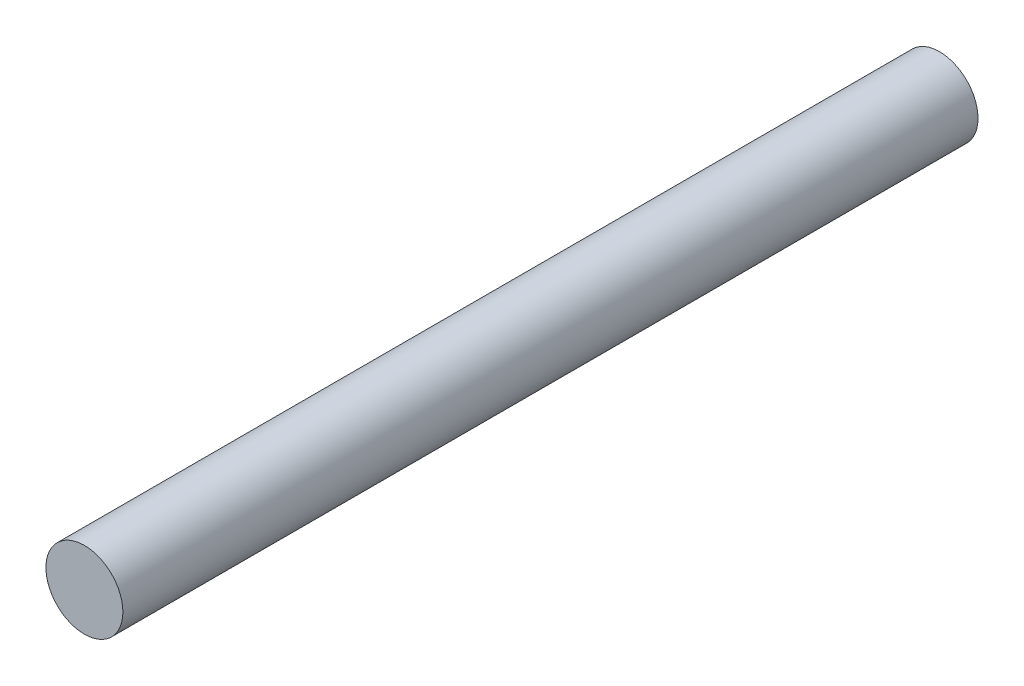
ISO-10303-21;
HEADER;
FILE_DESCRIPTION(('STEP AP214'),'2;1');
FILE_NAME('part.step','',(''),(''),'','','');
FILE_SCHEMA(('AUTOMOTIVE_DESIGN { 1 0 10303 214 1 1 1 1 }'));
ENDSEC;
DATA;
#1=APPLICATION_CONTEXT('core data for automotive mechanical design processes');
#2=APPLICATION_PROTOCOL_DEFINITION('international standard','automotive_design',2000,#1);
#3=PRODUCT_CONTEXT('',#1,'mechanical');
#4=PRODUCT('Part','Part','',(#3));
#5=PRODUCT_RELATED_PRODUCT_CATEGORY('part','',(#4));
#6=PRODUCT_DEFINITION_FORMATION('','',#4);
#7=PRODUCT_DEFINITION_CONTEXT('part definition',#1,'design');
#8=PRODUCT_DEFINITION('design','',#6,#7);
#9=PRODUCT_DEFINITION_SHAPE('','',#8);
#10=(LENGTH_UNIT() NAMED_UNIT(*) SI_UNIT(.MILLI.,.METRE.));
#11=(NAMED_UNIT(*) PLANE_ANGLE_UNIT() SI_UNIT($,.RADIAN.));
#12=(NAMED_UNIT(*) SI_UNIT($,.STERADIAN.) SOLID_ANGLE_UNIT());
#13=UNCERTAINTY_MEASURE_WITH_UNIT(LENGTH_MEASURE(1.E-05),#10,'distance_accuracy_value','');
#14=(GEOMETRIC_REPRESENTATION_CONTEXT(3) GLOBAL_UNCERTAINTY_ASSIGNED_CONTEXT((#13)) GLOBAL_UNIT_ASSIGNED_CONTEXT((#10,
#11,#12)) REPRESENTATION_CONTEXT('',''));
#15=CARTESIAN_POINT('',(0.,0.,0.));
#16=DIRECTION('',(0.,0.,1.));
#17=DIRECTION('',(1.,0.,0.));
#18=AXIS2_PLACEMENT_3D('',#15,#16,#17);
#19=CARTESIAN_POINT('',(0.,0.,40.));
#20=DIRECTION('',(0.,0.,-1.));
#21=DIRECTION('',(-1.,0.,0.));
#22=AXIS2_PLACEMENT_3D('',#19,#20,#21);
#23=CYLINDRICAL_SURFACE('',#22,1.8);
#24=CARTESIAN_POINT('',(0.,0.,40.));
#25=DIRECTION('',(0.,0.,1.));
#26=DIRECTION('',(1.,0.,0.));
#27=AXIS2_PLACEMENT_3D('',#24,#25,#26);
#28=CIRCLE('',#27,1.8);
#29=CARTESIAN_POINT('',(1.8,0.,40.));
#30=VERTEX_POINT('',#29);
#31=EDGE_CURVE('E10',#30,#30,#28,.T.);
#32=ORIENTED_EDGE('',*,*,#31,.F.);
#33=EDGE_LOOP('',(#32));
#34=FACE_BOUND('',#33,.T.);
#35=CARTESIAN_POINT('',(0.,0.,0.));
#36=DIRECTION('',(0.,0.,1.));
#37=DIRECTION('',(1.,0.,0.));
#38=AXIS2_PLACEMENT_3D('',#35,#36,#37);
#39=CIRCLE('',#38,1.8);
#40=CARTESIAN_POINT('',(1.8,0.,0.));
#41=VERTEX_POINT('',#40);
#42=EDGE_CURVE('E33',#41,#41,#39,.T.);
#43=ORIENTED_EDGE('',*,*,#42,.T.);
#44=EDGE_LOOP('',(#43));
#45=FACE_BOUND('',#44,.T.);
#46=ADVANCED_FACE('F30',(#34,#45),#23,.T.);
#47=CARTESIAN_POINT('',(0.,0.,40.));
#48=DIRECTION('',(0.,0.,1.));
#49=DIRECTION('',(1.,0.,0.));
#50=AXIS2_PLACEMENT_3D('',#47,#48,#49);
#51=PLANE('',#50);
#52=ORIENTED_EDGE('',*,*,#31,.T.);
#53=EDGE_LOOP('',(#52));
#54=FACE_BOUND('',#53,.T.);
#55=ADVANCED_FACE('F45',(#54),#51,.T.);
#56=CARTESIAN_POINT('',(0.,0.,0.));
#57=DIRECTION('',(0.,0.,1.));
#58=DIRECTION('',(1.,0.,0.));
#59=AXIS2_PLACEMENT_3D('',#56,#57,#58);
#60=PLANE('',#59);
#61=ORIENTED_EDGE('',*,*,#42,.F.);
#62=EDGE_LOOP('',(#61));
#63=FACE_BOUND('',#62,.T.);
#64=ADVANCED_FACE('F43',(#63),#60,.F.);
#65=CLOSED_SHELL('',(#46,#55,#64));
#66=MANIFOLD_SOLID_BREP('B2',#65);
#67=ADVANCED_BREP_SHAPE_REPRESENTATION('',(#18,#66),#14);
#68=SHAPE_DEFINITION_REPRESENTATION(#9,#67);
ENDSEC;
END-ISO-10303-21;
